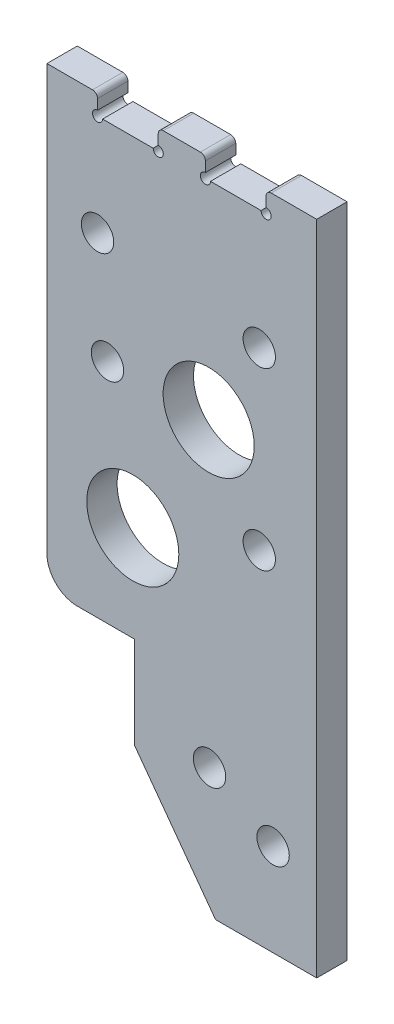
ISO-10303-21;
HEADER;
FILE_DESCRIPTION(('STEP AP214'),'2;1');
FILE_NAME('part.step','',(''),(''),'','','');
FILE_SCHEMA(('AUTOMOTIVE_DESIGN { 1 0 10303 214 1 1 1 1 }'));
ENDSEC;
DATA;
#1=APPLICATION_CONTEXT('core data for automotive mechanical design processes');
#2=APPLICATION_PROTOCOL_DEFINITION('international standard','automotive_design',2000,#1);
#3=PRODUCT_CONTEXT('',#1,'mechanical');
#4=PRODUCT('Part','Part','',(#3));
#5=PRODUCT_RELATED_PRODUCT_CATEGORY('part','',(#4));
#6=PRODUCT_DEFINITION_FORMATION('','',#4);
#7=PRODUCT_DEFINITION_CONTEXT('part definition',#1,'design');
#8=PRODUCT_DEFINITION('design','',#6,#7);
#9=PRODUCT_DEFINITION_SHAPE('','',#8);
#10=(LENGTH_UNIT() NAMED_UNIT(*) SI_UNIT(.MILLI.,.METRE.));
#11=(NAMED_UNIT(*) PLANE_ANGLE_UNIT() SI_UNIT($,.RADIAN.));
#12=(NAMED_UNIT(*) SI_UNIT($,.STERADIAN.) SOLID_ANGLE_UNIT());
#13=UNCERTAINTY_MEASURE_WITH_UNIT(LENGTH_MEASURE(1.E-05),#10,'distance_accuracy_value','');
#14=(GEOMETRIC_REPRESENTATION_CONTEXT(3) GLOBAL_UNCERTAINTY_ASSIGNED_CONTEXT((#13)) GLOBAL_UNIT_ASSIGNED_CONTEXT((#10,
#11,#12)) REPRESENTATION_CONTEXT('',''));
#15=CARTESIAN_POINT('',(0.,0.,0.));
#16=DIRECTION('',(0.,0.,1.));
#17=DIRECTION('',(1.,0.,0.));
#18=AXIS2_PLACEMENT_3D('',#15,#16,#17);
#19=CARTESIAN_POINT('',(0.,58.0360342106986,0.));
#20=DIRECTION('',(0.,-1.,0.));
#21=DIRECTION('',(0.,0.,-1.));
#22=AXIS2_PLACEMENT_3D('',#19,#20,#21);
#23=PLANE('',#22);
#24=DIRECTION('',(1.,0.,0.));
#25=VECTOR('',#24,1.);
#26=CARTESIAN_POINT('',(0.,58.0360342106986,3.));
#27=LINE('',#26,#25);
#28=CARTESIAN_POINT('',(-5.0000000000002,58.0360342106986,3.));
#29=VERTEX_POINT('',#28);
#30=CARTESIAN_POINT('',(-0.500000000000204,58.0360342106986,3.));
#31=VERTEX_POINT('',#30);
#32=EDGE_CURVE('E262',#29,#31,#27,.T.);
#33=ORIENTED_EDGE('',*,*,#32,.T.);
#34=DIRECTION('',(0.,0.,1.));
#35=VECTOR('',#34,1.);
#36=CARTESIAN_POINT('',(-0.500000000000204,58.0360342106986,0.));
#37=LINE('',#36,#35);
#38=CARTESIAN_POINT('',(-0.500000000000204,58.0360342106986,0.));
#39=VERTEX_POINT('',#38);
#40=EDGE_CURVE('E11',#31,#39,#37,.F.);
#41=ORIENTED_EDGE('',*,*,#40,.T.);
#42=DIRECTION('',(1.,0.,0.));
#43=VECTOR('',#42,1.);
#44=CARTESIAN_POINT('',(0.,58.0360342106986,0.));
#45=LINE('',#44,#43);
#46=CARTESIAN_POINT('',(-5.0000000000002,58.0360342106986,0.));
#47=VERTEX_POINT('',#46);
#48=EDGE_CURVE('E257',#47,#39,#45,.T.);
#49=ORIENTED_EDGE('',*,*,#48,.F.);
#50=DIRECTION('',(0.,0.,1.));
#51=VECTOR('',#50,1.);
#52=CARTESIAN_POINT('',(-5.0000000000002,58.0360342106986,0.));
#53=LINE('',#52,#51);
#54=EDGE_CURVE('E266',#47,#29,#53,.T.);
#55=ORIENTED_EDGE('',*,*,#54,.T.);
#56=EDGE_LOOP('',(#33,#41,#49,#55));
#57=FACE_BOUND('',#56,.T.);
#58=ADVANCED_FACE('F40',(#57),#23,.F.);
#59=CARTESIAN_POINT('',(6.4999999999998,58.0360342106986,3.));
#60=VERTEX_POINT('',#59);
#61=CARTESIAN_POINT('',(10.1622818720618,58.0360342106986,3.));
#62=VERTEX_POINT('',#61);
#63=EDGE_CURVE('E264',#60,#62,#27,.T.);
#64=ORIENTED_EDGE('',*,*,#63,.T.);
#65=DIRECTION('',(0.,0.,1.));
#66=VECTOR('',#65,1.);
#67=CARTESIAN_POINT('',(10.1622818720618,58.0360342106986,0.));
#68=LINE('',#67,#66);
#69=CARTESIAN_POINT('',(10.1622818720618,58.0360342106986,0.));
#70=VERTEX_POINT('',#69);
#71=EDGE_CURVE('E404',#62,#70,#68,.F.);
#72=ORIENTED_EDGE('',*,*,#71,.T.);
#73=CARTESIAN_POINT('',(6.4999999999998,58.0360342106986,0.));
#74=VERTEX_POINT('',#73);
#75=EDGE_CURVE('E260',#74,#70,#45,.T.);
#76=ORIENTED_EDGE('',*,*,#75,.F.);
#77=DIRECTION('',(0.,0.,1.));
#78=VECTOR('',#77,1.);
#79=CARTESIAN_POINT('',(6.4999999999998,58.0360342106986,0.));
#80=LINE('',#79,#78);
#81=EDGE_CURVE('E401',#74,#60,#80,.T.);
#82=ORIENTED_EDGE('',*,*,#81,.T.);
#83=EDGE_LOOP('',(#64,#72,#76,#82));
#84=FACE_BOUND('',#83,.T.);
#85=ADVANCED_FACE('F458',(#84),#23,.F.);
#86=CARTESIAN_POINT('',(21.6622818720618,0.,3.));
#87=DIRECTION('',(-1.,0.,0.));
#88=DIRECTION('',(0.,0.,1.));
#89=AXIS2_PLACEMENT_3D('',#86,#87,#88);
#90=PLANE('',#89);
#91=DIRECTION('',(0.,1.,0.));
#92=VECTOR('',#91,1.);
#93=CARTESIAN_POINT('',(21.6622818720618,0.,0.));
#94=LINE('',#93,#92);
#95=CARTESIAN_POINT('',(21.6622818720618,-6.90499539699892,0.));
#96=VERTEX_POINT('',#95);
#97=CARTESIAN_POINT('',(21.6622818720618,58.0360342106986,0.));
#98=VERTEX_POINT('',#97);
#99=EDGE_CURVE('E326',#96,#98,#94,.T.);
#100=ORIENTED_EDGE('',*,*,#99,.T.);
#101=DIRECTION('',(0.,0.,1.));
#102=VECTOR('',#101,1.);
#103=CARTESIAN_POINT('',(21.6622818720618,58.0360342106986,0.));
#104=LINE('',#103,#102);
#105=CARTESIAN_POINT('',(21.6622818720618,58.0360342106986,3.));
#106=VERTEX_POINT('',#105);
#107=EDGE_CURVE('E259',#98,#106,#104,.T.);
#108=ORIENTED_EDGE('',*,*,#107,.T.);
#109=DIRECTION('',(0.,1.,0.));
#110=VECTOR('',#109,1.);
#111=CARTESIAN_POINT('',(21.6622818720618,0.,3.));
#112=LINE('',#111,#110);
#113=CARTESIAN_POINT('',(21.6622818720618,-6.90499539699892,3.));
#114=VERTEX_POINT('',#113);
#115=EDGE_CURVE('E311',#114,#106,#112,.T.);
#116=ORIENTED_EDGE('',*,*,#115,.F.);
#117=DIRECTION('',(0.,0.,-1.));
#118=VECTOR('',#117,1.);
#119=CARTESIAN_POINT('',(21.6622818720618,-6.90499539699892,3.));
#120=LINE('',#119,#118);
#121=EDGE_CURVE('E320',#114,#96,#120,.T.);
#122=ORIENTED_EDGE('',*,*,#121,.T.);
#123=EDGE_LOOP('',(#100,#108,#116,#122));
#124=FACE_BOUND('',#123,.T.);
#125=ADVANCED_FACE('F465',(#124),#90,.F.);
#126=CARTESIAN_POINT('',(3.66228187206179,0.,3.));
#127=DIRECTION('',(1.,0.,0.));
#128=DIRECTION('',(0.,0.,-1.));
#129=AXIS2_PLACEMENT_3D('',#126,#127,#128);
#130=PLANE('',#129);
#131=DIRECTION('',(0.,-1.,0.));
#132=VECTOR('',#131,1.);
#133=CARTESIAN_POINT('',(3.66228187206179,0.,0.));
#134=LINE('',#133,#132);
#135=CARTESIAN_POINT('',(3.66228187206179,13.0950046030011,0.));
#136=VERTEX_POINT('',#135);
#137=CARTESIAN_POINT('',(3.66228187206179,3.99641148390984,0.));
#138=VERTEX_POINT('',#137);
#139=EDGE_CURVE('E329',#136,#138,#134,.T.);
#140=ORIENTED_EDGE('',*,*,#139,.T.);
#141=DIRECTION('',(0.,0.,-1.));
#142=VECTOR('',#141,1.);
#143=CARTESIAN_POINT('',(3.66228187206179,3.99641148390984,3.));
#144=LINE('',#143,#142);
#145=CARTESIAN_POINT('',(3.66228187206179,3.99641148390984,3.));
#146=VERTEX_POINT('',#145);
#147=EDGE_CURVE('E339',#146,#138,#144,.T.);
#148=ORIENTED_EDGE('',*,*,#147,.F.);
#149=DIRECTION('',(0.,-1.,0.));
#150=VECTOR('',#149,1.);
#151=CARTESIAN_POINT('',(3.66228187206179,0.,3.));
#152=LINE('',#151,#150);
#153=CARTESIAN_POINT('',(3.66228187206179,13.0950046030011,3.));
#154=VERTEX_POINT('',#153);
#155=EDGE_CURVE('E314',#154,#146,#152,.T.);
#156=ORIENTED_EDGE('',*,*,#155,.F.);
#157=DIRECTION('',(0.,0.,-1.));
#158=VECTOR('',#157,1.);
#159=CARTESIAN_POINT('',(3.66228187206179,13.0950046030011,3.));
#160=LINE('',#159,#158);
#161=EDGE_CURVE('E342',#154,#136,#160,.T.);
#162=ORIENTED_EDGE('',*,*,#161,.T.);
#163=EDGE_LOOP('',(#140,#148,#156,#162));
#164=FACE_BOUND('',#163,.T.);
#165=ADVANCED_FACE('F527',(#164),#130,.F.);
#166=CARTESIAN_POINT('',(4.28657415969723,3.14570345389393,3.));
#167=DIRECTION('',(0.806206221061157,0.591634624681727,0.));
#168=DIRECTION('',(-0.591634624681728,0.806206221061157,0.));
#169=AXIS2_PLACEMENT_3D('',#166,#167,#168);
#170=PLANE('',#169);
#171=DIRECTION('',(0.591634624681727,-0.806206221061157,0.));
#172=VECTOR('',#171,1.);
#173=CARTESIAN_POINT('',(4.28657415969723,3.14570345389393,0.));
#174=LINE('',#173,#172);
#175=CARTESIAN_POINT('',(11.6622818720618,-6.90499539699892,0.));
#176=VERTEX_POINT('',#175);
#177=EDGE_CURVE('E331',#138,#176,#174,.T.);
#178=ORIENTED_EDGE('',*,*,#177,.T.);
#179=DIRECTION('',(0.,0.,-1.));
#180=VECTOR('',#179,1.);
#181=CARTESIAN_POINT('',(11.6622818720618,-6.90499539699892,3.));
#182=LINE('',#181,#180);
#183=CARTESIAN_POINT('',(11.6622818720618,-6.90499539699892,3.));
#184=VERTEX_POINT('',#183);
#185=EDGE_CURVE('E336',#184,#176,#182,.T.);
#186=ORIENTED_EDGE('',*,*,#185,.F.);
#187=DIRECTION('',(0.591634624681727,-0.806206221061157,0.));
#188=VECTOR('',#187,1.);
#189=CARTESIAN_POINT('',(4.28657415969723,3.14570345389393,3.));
#190=LINE('',#189,#188);
#191=EDGE_CURVE('E316',#146,#184,#190,.T.);
#192=ORIENTED_EDGE('',*,*,#191,.F.);
#193=ORIENTED_EDGE('',*,*,#147,.T.);
#194=EDGE_LOOP('',(#178,#186,#192,#193));
#195=FACE_BOUND('',#194,.T.);
#196=ADVANCED_FACE('F523',(#195),#170,.F.);
#197=CARTESIAN_POINT('',(11.0719234852407,5.8086443959848,3.));
#198=DIRECTION('',(0.,0.,-1.));
#199=DIRECTION('',(-1.,0.,0.));
#200=AXIS2_PLACEMENT_3D('',#197,#198,#199);
#201=CYLINDRICAL_SURFACE('',#200,1.6);
#202=CARTESIAN_POINT('',(11.0719234852407,5.8086443959848,3.));
#203=DIRECTION('',(0.,0.,1.));
#204=DIRECTION('',(1.,0.,0.));
#205=AXIS2_PLACEMENT_3D('',#202,#203,#204);
#206=CIRCLE('',#205,1.6);
#207=CARTESIAN_POINT('',(12.6719234852407,5.8086443959848,3.));
#208=VERTEX_POINT('',#207);
#209=EDGE_CURVE('E307',#208,#208,#206,.T.);
#210=ORIENTED_EDGE('',*,*,#209,.T.);
#211=EDGE_LOOP('',(#210));
#212=FACE_BOUND('',#211,.T.);
#213=CARTESIAN_POINT('',(11.0719234852407,5.8086443959848,0.));
#214=DIRECTION('',(0.,0.,1.));
#215=DIRECTION('',(1.,0.,0.));
#216=AXIS2_PLACEMENT_3D('',#213,#214,#215);
#217=CIRCLE('',#216,1.6);
#218=CARTESIAN_POINT('',(12.6719234852407,5.8086443959848,0.));
#219=VERTEX_POINT('',#218);
#220=EDGE_CURVE('E323',#219,#219,#217,.T.);
#221=ORIENTED_EDGE('',*,*,#220,.F.);
#222=EDGE_LOOP('',(#221));
#223=FACE_BOUND('',#222,.T.);
#224=ADVANCED_FACE('F559',(#212,#223),#201,.F.);
#225=CARTESIAN_POINT('',(17.3507061173,2.224156972777,3.));
#226=DIRECTION('',(0.,0.,-1.));
#227=DIRECTION('',(-1.,0.,0.));
#228=AXIS2_PLACEMENT_3D('',#225,#226,#227);
#229=CYLINDRICAL_SURFACE('',#228,1.6);
#230=CARTESIAN_POINT('',(17.3507061173,2.224156972777,3.));
#231=DIRECTION('',(0.,0.,1.));
#232=DIRECTION('',(1.,0.,0.));
#233=AXIS2_PLACEMENT_3D('',#230,#231,#232);
#234=CIRCLE('',#233,1.6);
#235=CARTESIAN_POINT('',(18.9507061173,2.224156972777,3.));
#236=VERTEX_POINT('',#235);
#237=EDGE_CURVE('E304',#236,#236,#234,.T.);
#238=ORIENTED_EDGE('',*,*,#237,.T.);
#239=EDGE_LOOP('',(#238));
#240=FACE_BOUND('',#239,.T.);
#241=CARTESIAN_POINT('',(17.3507061173,2.224156972777,0.));
#242=DIRECTION('',(0.,0.,1.));
#243=DIRECTION('',(1.,0.,0.));
#244=AXIS2_PLACEMENT_3D('',#241,#242,#243);
#245=CIRCLE('',#244,1.6);
#246=CARTESIAN_POINT('',(18.9507061173,2.224156972777,0.));
#247=VERTEX_POINT('',#246);
#248=EDGE_CURVE('E300',#247,#247,#245,.T.);
#249=ORIENTED_EDGE('',*,*,#248,.F.);
#250=EDGE_LOOP('',(#249));
#251=FACE_BOUND('',#250,.T.);
#252=ADVANCED_FACE('F556',(#240,#251),#229,.F.);
#253=CARTESIAN_POINT('',(0.,-6.90499539699891,3.));
#254=DIRECTION('',(0.,1.,0.));
#255=DIRECTION('',(-1.,0.,0.));
#256=AXIS2_PLACEMENT_3D('',#253,#254,#255);
#257=PLANE('',#256);
#258=DIRECTION('',(1.,0.,0.));
#259=VECTOR('',#258,1.);
#260=CARTESIAN_POINT('',(0.,-6.90499539699891,0.));
#261=LINE('',#260,#259);
#262=EDGE_CURVE('E308',#176,#96,#261,.T.);
#263=ORIENTED_EDGE('',*,*,#262,.T.);
#264=ORIENTED_EDGE('',*,*,#121,.F.);
#265=DIRECTION('',(1.,0.,0.));
#266=VECTOR('',#265,1.);
#267=CARTESIAN_POINT('',(0.,-6.90499539699891,3.));
#268=LINE('',#267,#266);
#269=EDGE_CURVE('E318',#184,#114,#268,.T.);
#270=ORIENTED_EDGE('',*,*,#269,.F.);
#271=ORIENTED_EDGE('',*,*,#185,.T.);
#272=EDGE_LOOP('',(#263,#264,#270,#271));
#273=FACE_BOUND('',#272,.T.);
#274=ADVANCED_FACE('F519',(#273),#257,.F.);
#275=CARTESIAN_POINT('',(0.,0.,3.));
#276=DIRECTION('',(0.,0.,1.));
#277=DIRECTION('',(1.,0.,0.));
#278=AXIS2_PLACEMENT_3D('',#275,#276,#277);
#279=PLANE('',#278);
#280=CARTESIAN_POINT('',(17.1622818720618,58.0360342106986,3.));
#281=VERTEX_POINT('',#280);
#282=EDGE_CURVE('E265',#281,#106,#27,.T.);
#283=ORIENTED_EDGE('',*,*,#282,.F.);
#284=CARTESIAN_POINT('',(17.1622818720618,57.5360342106986,3.));
#285=DIRECTION('',(0.,0.,1.));
#286=DIRECTION('',(1.,0.,0.));
#287=AXIS2_PLACEMENT_3D('',#284,#285,#286);
#288=CIRCLE('',#287,0.5);
#289=CARTESIAN_POINT('',(16.6622818720618,57.5360342106986,3.));
#290=VERTEX_POINT('',#289);
#291=EDGE_CURVE('E387',#281,#290,#288,.T.);
#292=ORIENTED_EDGE('',*,*,#291,.T.);
#293=DIRECTION('',(0.,1.,0.));
#294=VECTOR('',#293,1.);
#295=CARTESIAN_POINT('',(16.6622818720618,58.0360342106986,3.));
#296=LINE('',#295,#294);
#297=CARTESIAN_POINT('',(16.6622818720618,56.5360342106986,3.));
#298=VERTEX_POINT('',#297);
#299=EDGE_CURVE('E243',#298,#290,#296,.T.);
#300=ORIENTED_EDGE('',*,*,#299,.F.);
#301=CARTESIAN_POINT('',(16.6622818720618,56.0360342106986,3.));
#302=DIRECTION('',(0.,0.,1.));
#303=DIRECTION('',(1.,0.,0.));
#304=AXIS2_PLACEMENT_3D('',#301,#302,#303);
#305=CIRCLE('',#304,0.499999999999999);
#306=CARTESIAN_POINT('',(16.1622818720618,56.0360342106986,3.));
#307=VERTEX_POINT('',#306);
#308=EDGE_CURVE('E439',#307,#298,#305,.T.);
#309=ORIENTED_EDGE('',*,*,#308,.F.);
#310=DIRECTION('',(1.,0.,0.));
#311=VECTOR('',#310,1.);
#312=CARTESIAN_POINT('',(10.6622818720618,56.0360342106986,3.));
#313=LINE('',#312,#311);
#314=CARTESIAN_POINT('',(11.1622818720618,56.0360342106986,3.));
#315=VERTEX_POINT('',#314);
#316=EDGE_CURVE('E251',#315,#307,#313,.T.);
#317=ORIENTED_EDGE('',*,*,#316,.F.);
#318=CARTESIAN_POINT('',(10.6622818720618,56.0360342106986,3.));
#319=DIRECTION('',(0.,0.,1.));
#320=DIRECTION('',(1.,0.,0.));
#321=AXIS2_PLACEMENT_3D('',#318,#319,#320);
#322=CIRCLE('',#321,0.500000000000001);
#323=CARTESIAN_POINT('',(10.6622818720618,56.5360342106986,3.));
#324=VERTEX_POINT('',#323);
#325=EDGE_CURVE('E213',#324,#315,#322,.T.);
#326=ORIENTED_EDGE('',*,*,#325,.F.);
#327=DIRECTION('',(0.,-1.,0.));
#328=VECTOR('',#327,1.);
#329=CARTESIAN_POINT('',(10.6622818720618,58.0360342106986,3.));
#330=LINE('',#329,#328);
#331=CARTESIAN_POINT('',(10.6622818720618,57.5360342106986,3.));
#332=VERTEX_POINT('',#331);
#333=EDGE_CURVE('E249',#332,#324,#330,.T.);
#334=ORIENTED_EDGE('',*,*,#333,.F.);
#335=CARTESIAN_POINT('',(10.1622818720618,57.5360342106986,3.));
#336=DIRECTION('',(0.,0.,1.));
#337=DIRECTION('',(1.,0.,0.));
#338=AXIS2_PLACEMENT_3D('',#335,#336,#337);
#339=CIRCLE('',#338,0.5);
#340=EDGE_CURVE('E385',#332,#62,#339,.T.);
#341=ORIENTED_EDGE('',*,*,#340,.T.);
#342=ORIENTED_EDGE('',*,*,#63,.F.);
#343=CARTESIAN_POINT('',(6.4999999999998,57.5360342106986,3.));
#344=DIRECTION('',(0.,0.,1.));
#345=DIRECTION('',(1.,0.,0.));
#346=AXIS2_PLACEMENT_3D('',#343,#344,#345);
#347=CIRCLE('',#346,0.5);
#348=CARTESIAN_POINT('',(5.9999999999998,57.5360342106986,3.));
#349=VERTEX_POINT('',#348);
#350=EDGE_CURVE('E230',#60,#349,#347,.T.);
#351=ORIENTED_EDGE('',*,*,#350,.T.);
#352=DIRECTION('',(0.,1.,0.));
#353=VECTOR('',#352,1.);
#354=CARTESIAN_POINT('',(5.9999999999998,58.0360342106986,3.));
#355=LINE('',#354,#353);
#356=CARTESIAN_POINT('',(5.9999999999998,56.5360342106986,3.));
#357=VERTEX_POINT('',#356);
#358=EDGE_CURVE('E219',#357,#349,#355,.T.);
#359=ORIENTED_EDGE('',*,*,#358,.F.);
#360=CARTESIAN_POINT('',(5.9999999999998,56.0360342106986,3.));
#361=DIRECTION('',(0.,0.,1.));
#362=DIRECTION('',(1.,0.,0.));
#363=AXIS2_PLACEMENT_3D('',#360,#361,#362);
#364=CIRCLE('',#363,0.500000000000002);
#365=CARTESIAN_POINT('',(5.49999999999979,56.0360342106986,3.));
#366=VERTEX_POINT('',#365);
#367=EDGE_CURVE('E201',#366,#357,#364,.T.);
#368=ORIENTED_EDGE('',*,*,#367,.F.);
#369=DIRECTION('',(1.,0.,0.));
#370=VECTOR('',#369,1.);
#371=CARTESIAN_POINT('',(-2.03585079067445E-13,56.0360342106986,3.));
#372=LINE('',#371,#370);
#373=CARTESIAN_POINT('',(0.499999999999797,56.0360342106986,3.));
#374=VERTEX_POINT('',#373);
#375=EDGE_CURVE('E232',#374,#366,#372,.T.);
#376=ORIENTED_EDGE('',*,*,#375,.F.);
#377=CARTESIAN_POINT('',(-2.03585079067445E-13,56.0360342106986,3.));
#378=DIRECTION('',(0.,0.,1.));
#379=DIRECTION('',(1.,0.,0.));
#380=AXIS2_PLACEMENT_3D('',#377,#378,#379);
#381=CIRCLE('',#380,0.5);
#382=CARTESIAN_POINT('',(-2.03646311407403E-13,56.5360342106986,3.));
#383=VERTEX_POINT('',#382);
#384=EDGE_CURVE('E212',#383,#374,#381,.T.);
#385=ORIENTED_EDGE('',*,*,#384,.F.);
#386=DIRECTION('',(0.,-1.,0.));
#387=VECTOR('',#386,1.);
#388=CARTESIAN_POINT('',(-2.03830008427275E-13,58.0360342106986,3.));
#389=LINE('',#388,#387);
#390=CARTESIAN_POINT('',(-2.03768776087317E-13,57.5360342106986,3.));
#391=VERTEX_POINT('',#390);
#392=EDGE_CURVE('E236',#391,#383,#389,.T.);
#393=ORIENTED_EDGE('',*,*,#392,.F.);
#394=CARTESIAN_POINT('',(-0.500000000000204,57.5360342106986,3.));
#395=DIRECTION('',(0.,0.,1.));
#396=DIRECTION('',(1.,0.,0.));
#397=AXIS2_PLACEMENT_3D('',#394,#395,#396);
#398=CIRCLE('',#397,0.5);
#399=EDGE_CURVE('E382',#391,#31,#398,.T.);
#400=ORIENTED_EDGE('',*,*,#399,.T.);
#401=ORIENTED_EDGE('',*,*,#32,.F.);
#402=DIRECTION('',(0.,-1.,0.));
#403=VECTOR('',#402,1.);
#404=CARTESIAN_POINT('',(-5.00000000000018,55.0950046030011,3.));
#405=LINE('',#404,#403);
#406=CARTESIAN_POINT('',(-5.00000000000018,16.0950046030011,3.));
#407=VERTEX_POINT('',#406);
#408=EDGE_CURVE('E298',#29,#407,#405,.T.);
#409=ORIENTED_EDGE('',*,*,#408,.T.);
#410=CARTESIAN_POINT('',(-2.00000000000018,16.0950046030011,3.));
#411=DIRECTION('',(0.,0.,1.));
#412=DIRECTION('',(1.,0.,0.));
#413=AXIS2_PLACEMENT_3D('',#410,#411,#412);
#414=CIRCLE('',#413,3.);
#415=CARTESIAN_POINT('',(-2.00000000000018,13.0950046030011,3.));
#416=VERTEX_POINT('',#415);
#417=EDGE_CURVE('E348',#407,#416,#414,.T.);
#418=ORIENTED_EDGE('',*,*,#417,.T.);
#419=DIRECTION('',(1.,0.,0.));
#420=VECTOR('',#419,1.);
#421=CARTESIAN_POINT('',(-5.00000000000018,13.0950046030011,3.));
#422=LINE('',#421,#420);
#423=EDGE_CURVE('E301',#416,#154,#422,.T.);
#424=ORIENTED_EDGE('',*,*,#423,.T.);
#425=ORIENTED_EDGE('',*,*,#155,.T.);
#426=ORIENTED_EDGE('',*,*,#191,.T.);
#427=ORIENTED_EDGE('',*,*,#269,.T.);
#428=ORIENTED_EDGE('',*,*,#115,.T.);
#429=EDGE_LOOP('',(#283,#292,#300,#309,#317,#326,#334,#341,#342,#351,#359,#368,#376,#385,#393,
#400,#401,#409,#418,#424,#425,#426,#427,#428));
#430=FACE_BOUND('',#429,.T.);
#431=CARTESIAN_POINT('',(-2.03830008427275E-13,46.0360342106986,3.));
#432=DIRECTION('',(0.,0.,1.));
#433=DIRECTION('',(1.,0.,0.));
#434=AXIS2_PLACEMENT_3D('',#431,#432,#433);
#435=CIRCLE('',#434,1.6);
#436=CARTESIAN_POINT('',(1.5999999999998,46.0360342106986,3.));
#437=VERTEX_POINT('',#436);
#438=EDGE_CURVE('E269',#437,#437,#435,.F.);
#439=ORIENTED_EDGE('',*,*,#438,.T.);
#440=EDGE_LOOP('',(#439));
#441=FACE_BOUND('',#440,.T.);
#442=CARTESIAN_POINT('',(0.984643758680834,35.5323305802641,3.));
#443=DIRECTION('',(0.,0.,1.));
#444=DIRECTION('',(1.,0.,0.));
#445=AXIS2_PLACEMENT_3D('',#442,#443,#444);
#446=CIRCLE('',#445,1.6);
#447=CARTESIAN_POINT('',(2.58464375868083,35.5323305802641,3.));
#448=VERTEX_POINT('',#447);
#449=EDGE_CURVE('E275',#448,#448,#446,.T.);
#450=ORIENTED_EDGE('',*,*,#449,.F.);
#451=EDGE_LOOP('',(#450));
#452=FACE_BOUND('',#451,.T.);
#453=CARTESIAN_POINT('',(15.9846437586809,44.1925846181082,3.));
#454=DIRECTION('',(0.,0.,1.));
#455=DIRECTION('',(1.,0.,0.));
#456=AXIS2_PLACEMENT_3D('',#453,#454,#455);
#457=CIRCLE('',#456,1.6);
#458=CARTESIAN_POINT('',(17.5846437586809,44.1925846181082,3.));
#459=VERTEX_POINT('',#458);
#460=EDGE_CURVE('E279',#459,#459,#457,.T.);
#461=ORIENTED_EDGE('',*,*,#460,.F.);
#462=EDGE_LOOP('',(#461));
#463=FACE_BOUND('',#462,.T.);
#464=CARTESIAN_POINT('',(15.9846437586806,26.8720765424193,3.));
#465=DIRECTION('',(0.,0.,1.));
#466=DIRECTION('',(1.,0.,0.));
#467=AXIS2_PLACEMENT_3D('',#464,#465,#466);
#468=CIRCLE('',#467,1.6);
#469=CARTESIAN_POINT('',(17.5846437586806,26.8720765424193,3.));
#470=VERTEX_POINT('',#469);
#471=EDGE_CURVE('E282',#470,#470,#468,.T.);
#472=ORIENTED_EDGE('',*,*,#471,.F.);
#473=EDGE_LOOP('',(#472));
#474=FACE_BOUND('',#473,.T.);
#475=CARTESIAN_POINT('',(10.9846437586808,35.5323305802638,3.));
#476=DIRECTION('',(0.,0.,1.));
#477=DIRECTION('',(1.,0.,0.));
#478=AXIS2_PLACEMENT_3D('',#475,#476,#477);
#479=CIRCLE('',#478,4.5);
#480=CARTESIAN_POINT('',(15.4846437586808,35.5323305802638,3.));
#481=VERTEX_POINT('',#480);
#482=EDGE_CURVE('E285',#481,#481,#479,.T.);
#483=ORIENTED_EDGE('',*,*,#482,.F.);
#484=EDGE_LOOP('',(#483));
#485=FACE_BOUND('',#484,.T.);
#486=CARTESIAN_POINT('',(3.48464375868086,22.5419495234972,3.));
#487=DIRECTION('',(0.,0.,1.));
#488=DIRECTION('',(1.,0.,0.));
#489=AXIS2_PLACEMENT_3D('',#486,#487,#488);
#490=CIRCLE('',#489,4.55);
#491=CARTESIAN_POINT('',(8.03464375868087,22.5419495234972,3.));
#492=VERTEX_POINT('',#491);
#493=EDGE_CURVE('E290',#492,#492,#490,.T.);
#494=ORIENTED_EDGE('',*,*,#493,.F.);
#495=EDGE_LOOP('',(#494));
#496=FACE_BOUND('',#495,.T.);
#497=ORIENTED_EDGE('',*,*,#237,.F.);
#498=EDGE_LOOP('',(#497));
#499=FACE_BOUND('',#498,.T.);
#500=ORIENTED_EDGE('',*,*,#209,.F.);
#501=EDGE_LOOP('',(#500));
#502=FACE_BOUND('',#501,.T.);
#503=ADVANCED_FACE('F227',(#430,#441,#452,#463,#474,#485,#496,#499,#502),#279,.T.);
#504=CARTESIAN_POINT('',(0.,0.,0.));
#505=DIRECTION('',(0.,0.,1.));
#506=DIRECTION('',(1.,0.,0.));
#507=AXIS2_PLACEMENT_3D('',#504,#505,#506);
#508=PLANE('',#507);
#509=DIRECTION('',(0.,1.,0.));
#510=VECTOR('',#509,1.);
#511=CARTESIAN_POINT('',(16.6622818720618,58.0360342106986,0.));
#512=LINE('',#511,#510);
#513=CARTESIAN_POINT('',(16.6622818720618,56.5360342106986,0.));
#514=VERTEX_POINT('',#513);
#515=CARTESIAN_POINT('',(16.6622818720618,57.5360342106986,0.));
#516=VERTEX_POINT('',#515);
#517=EDGE_CURVE('E246',#514,#516,#512,.T.);
#518=ORIENTED_EDGE('',*,*,#517,.T.);
#519=CARTESIAN_POINT('',(17.1622818720618,57.5360342106986,0.));
#520=DIRECTION('',(0.,0.,1.));
#521=DIRECTION('',(1.,0.,0.));
#522=AXIS2_PLACEMENT_3D('',#519,#520,#521);
#523=CIRCLE('',#522,0.5);
#524=CARTESIAN_POINT('',(17.1622818720618,58.0360342106986,0.));
#525=VERTEX_POINT('',#524);
#526=EDGE_CURVE('E396',#516,#525,#523,.F.);
#527=ORIENTED_EDGE('',*,*,#526,.T.);
#528=EDGE_CURVE('E261',#525,#98,#45,.T.);
#529=ORIENTED_EDGE('',*,*,#528,.T.);
#530=ORIENTED_EDGE('',*,*,#99,.F.);
#531=ORIENTED_EDGE('',*,*,#262,.F.);
#532=ORIENTED_EDGE('',*,*,#177,.F.);
#533=ORIENTED_EDGE('',*,*,#139,.F.);
#534=DIRECTION('',(1.,0.,0.));
#535=VECTOR('',#534,1.);
#536=CARTESIAN_POINT('',(-5.00000000000018,13.0950046030011,0.));
#537=LINE('',#536,#535);
#538=CARTESIAN_POINT('',(-2.00000000000018,13.0950046030011,0.));
#539=VERTEX_POINT('',#538);
#540=EDGE_CURVE('E295',#539,#136,#537,.T.);
#541=ORIENTED_EDGE('',*,*,#540,.F.);
#542=CARTESIAN_POINT('',(-2.00000000000018,16.0950046030011,0.));
#543=DIRECTION('',(0.,0.,1.));
#544=DIRECTION('',(1.,0.,0.));
#545=AXIS2_PLACEMENT_3D('',#542,#543,#544);
#546=CIRCLE('',#545,3.);
#547=CARTESIAN_POINT('',(-5.00000000000018,16.0950046030011,0.));
#548=VERTEX_POINT('',#547);
#549=EDGE_CURVE('E352',#539,#548,#546,.F.);
#550=ORIENTED_EDGE('',*,*,#549,.T.);
#551=DIRECTION('',(0.,-1.,0.));
#552=VECTOR('',#551,1.);
#553=CARTESIAN_POINT('',(-5.00000000000018,55.0950046030011,0.));
#554=LINE('',#553,#552);
#555=EDGE_CURVE('E297',#47,#548,#554,.T.);
#556=ORIENTED_EDGE('',*,*,#555,.F.);
#557=ORIENTED_EDGE('',*,*,#48,.T.);
#558=CARTESIAN_POINT('',(-0.500000000000204,57.5360342106986,0.));
#559=DIRECTION('',(0.,0.,1.));
#560=DIRECTION('',(1.,0.,0.));
#561=AXIS2_PLACEMENT_3D('',#558,#559,#560);
#562=CIRCLE('',#561,0.5);
#563=CARTESIAN_POINT('',(-2.03768776087317E-13,57.5360342106986,0.));
#564=VERTEX_POINT('',#563);
#565=EDGE_CURVE('E391',#39,#564,#562,.F.);
#566=ORIENTED_EDGE('',*,*,#565,.T.);
#567=DIRECTION('',(0.,-1.,0.));
#568=VECTOR('',#567,1.);
#569=CARTESIAN_POINT('',(-2.03830008427275E-13,58.0360342106986,0.));
#570=LINE('',#569,#568);
#571=CARTESIAN_POINT('',(-2.03646311407403E-13,56.5360342106986,0.));
#572=VERTEX_POINT('',#571);
#573=EDGE_CURVE('E231',#564,#572,#570,.T.);
#574=ORIENTED_EDGE('',*,*,#573,.T.);
#575=CARTESIAN_POINT('',(-2.03585079067445E-13,56.0360342106986,0.));
#576=DIRECTION('',(0.,0.,1.));
#577=DIRECTION('',(1.,0.,0.));
#578=AXIS2_PLACEMENT_3D('',#575,#576,#577);
#579=CIRCLE('',#578,0.5);
#580=CARTESIAN_POINT('',(0.499999999999797,56.0360342106986,0.));
#581=VERTEX_POINT('',#580);
#582=EDGE_CURVE('E223',#572,#581,#579,.T.);
#583=ORIENTED_EDGE('',*,*,#582,.T.);
#584=DIRECTION('',(1.,0.,0.));
#585=VECTOR('',#584,1.);
#586=CARTESIAN_POINT('',(-2.03585079067445E-13,56.0360342106986,0.));
#587=LINE('',#586,#585);
#588=CARTESIAN_POINT('',(5.49999999999979,56.0360342106986,0.));
#589=VERTEX_POINT('',#588);
#590=EDGE_CURVE('E234',#581,#589,#587,.T.);
#591=ORIENTED_EDGE('',*,*,#590,.T.);
#592=CARTESIAN_POINT('',(5.9999999999998,56.0360342106986,0.));
#593=DIRECTION('',(0.,0.,1.));
#594=DIRECTION('',(1.,0.,0.));
#595=AXIS2_PLACEMENT_3D('',#592,#593,#594);
#596=CIRCLE('',#595,0.500000000000002);
#597=CARTESIAN_POINT('',(5.9999999999998,56.5360342106986,0.));
#598=VERTEX_POINT('',#597);
#599=EDGE_CURVE('E224',#589,#598,#596,.T.);
#600=ORIENTED_EDGE('',*,*,#599,.T.);
#601=DIRECTION('',(0.,1.,0.));
#602=VECTOR('',#601,1.);
#603=CARTESIAN_POINT('',(5.9999999999998,58.0360342106986,0.));
#604=LINE('',#603,#602);
#605=CARTESIAN_POINT('',(5.9999999999998,57.5360342106986,0.));
#606=VERTEX_POINT('',#605);
#607=EDGE_CURVE('E222',#598,#606,#604,.T.);
#608=ORIENTED_EDGE('',*,*,#607,.T.);
#609=CARTESIAN_POINT('',(6.4999999999998,57.5360342106986,0.));
#610=DIRECTION('',(0.,0.,1.));
#611=DIRECTION('',(1.,0.,0.));
#612=AXIS2_PLACEMENT_3D('',#609,#610,#611);
#613=CIRCLE('',#612,0.5);
#614=EDGE_CURVE('E393',#606,#74,#613,.F.);
#615=ORIENTED_EDGE('',*,*,#614,.T.);
#616=ORIENTED_EDGE('',*,*,#75,.T.);
#617=CARTESIAN_POINT('',(10.1622818720618,57.5360342106986,0.));
#618=DIRECTION('',(0.,0.,1.));
#619=DIRECTION('',(1.,0.,0.));
#620=AXIS2_PLACEMENT_3D('',#617,#618,#619);
#621=CIRCLE('',#620,0.5);
#622=CARTESIAN_POINT('',(10.6622818720618,57.5360342106986,0.));
#623=VERTEX_POINT('',#622);
#624=EDGE_CURVE('E61',#70,#623,#621,.F.);
#625=ORIENTED_EDGE('',*,*,#624,.T.);
#626=DIRECTION('',(0.,-1.,0.));
#627=VECTOR('',#626,1.);
#628=CARTESIAN_POINT('',(10.6622818720618,58.0360342106986,0.));
#629=LINE('',#628,#627);
#630=CARTESIAN_POINT('',(10.6622818720618,56.5360342106986,0.));
#631=VERTEX_POINT('',#630);
#632=EDGE_CURVE('E240',#623,#631,#629,.T.);
#633=ORIENTED_EDGE('',*,*,#632,.T.);
#634=CARTESIAN_POINT('',(10.6622818720618,56.0360342106986,0.));
#635=DIRECTION('',(0.,0.,1.));
#636=DIRECTION('',(1.,0.,0.));
#637=AXIS2_PLACEMENT_3D('',#634,#635,#636);
#638=CIRCLE('',#637,0.500000000000001);
#639=CARTESIAN_POINT('',(11.1622818720618,56.0360342106986,0.));
#640=VERTEX_POINT('',#639);
#641=EDGE_CURVE('E425',#631,#640,#638,.T.);
#642=ORIENTED_EDGE('',*,*,#641,.T.);
#643=DIRECTION('',(1.,0.,0.));
#644=VECTOR('',#643,1.);
#645=CARTESIAN_POINT('',(10.6622818720618,56.0360342106986,0.));
#646=LINE('',#645,#644);
#647=CARTESIAN_POINT('',(16.1622818720618,56.0360342106986,0.));
#648=VERTEX_POINT('',#647);
#649=EDGE_CURVE('E242',#640,#648,#646,.T.);
#650=ORIENTED_EDGE('',*,*,#649,.T.);
#651=CARTESIAN_POINT('',(16.6622818720618,56.0360342106986,0.));
#652=DIRECTION('',(0.,0.,1.));
#653=DIRECTION('',(1.,0.,0.));
#654=AXIS2_PLACEMENT_3D('',#651,#652,#653);
#655=CIRCLE('',#654,0.499999999999999);
#656=EDGE_CURVE('E431',#648,#514,#655,.T.);
#657=ORIENTED_EDGE('',*,*,#656,.T.);
#658=EDGE_LOOP('',(#518,#527,#529,#530,#531,#532,#533,#541,#550,#556,#557,#566,#574,#583,#591,
#600,#608,#615,#616,#625,#633,#642,#650,#657));
#659=FACE_BOUND('',#658,.T.);
#660=CARTESIAN_POINT('',(-2.03830008427275E-13,46.0360342106986,0.));
#661=DIRECTION('',(0.,0.,1.));
#662=DIRECTION('',(1.,0.,0.));
#663=AXIS2_PLACEMENT_3D('',#660,#661,#662);
#664=CIRCLE('',#663,1.6);
#665=CARTESIAN_POINT('',(1.5999999999998,46.0360342106986,0.));
#666=VERTEX_POINT('',#665);
#667=EDGE_CURVE('E274',#666,#666,#664,.F.);
#668=ORIENTED_EDGE('',*,*,#667,.F.);
#669=EDGE_LOOP('',(#668));
#670=FACE_BOUND('',#669,.T.);
#671=CARTESIAN_POINT('',(0.984643758680834,35.5323305802641,0.));
#672=DIRECTION('',(0.,0.,1.));
#673=DIRECTION('',(1.,0.,0.));
#674=AXIS2_PLACEMENT_3D('',#671,#672,#673);
#675=CIRCLE('',#674,1.6);
#676=CARTESIAN_POINT('',(2.58464375868083,35.5323305802641,0.));
#677=VERTEX_POINT('',#676);
#678=EDGE_CURVE('E289',#677,#677,#675,.T.);
#679=ORIENTED_EDGE('',*,*,#678,.T.);
#680=EDGE_LOOP('',(#679));
#681=FACE_BOUND('',#680,.T.);
#682=CARTESIAN_POINT('',(15.9846437586809,44.1925846181082,0.));
#683=DIRECTION('',(0.,0.,1.));
#684=DIRECTION('',(1.,0.,0.));
#685=AXIS2_PLACEMENT_3D('',#682,#683,#684);
#686=CIRCLE('',#685,1.6);
#687=CARTESIAN_POINT('',(17.5846437586809,44.1925846181082,0.));
#688=VERTEX_POINT('',#687);
#689=EDGE_CURVE('E362',#688,#688,#686,.T.);
#690=ORIENTED_EDGE('',*,*,#689,.T.);
#691=EDGE_LOOP('',(#690));
#692=FACE_BOUND('',#691,.T.);
#693=CARTESIAN_POINT('',(15.9846437586806,26.8720765424193,0.));
#694=DIRECTION('',(0.,0.,1.));
#695=DIRECTION('',(1.,0.,0.));
#696=AXIS2_PLACEMENT_3D('',#693,#694,#695);
#697=CIRCLE('',#696,1.6);
#698=CARTESIAN_POINT('',(17.5846437586806,26.8720765424193,0.));
#699=VERTEX_POINT('',#698);
#700=EDGE_CURVE('E278',#699,#699,#697,.T.);
#701=ORIENTED_EDGE('',*,*,#700,.T.);
#702=EDGE_LOOP('',(#701));
#703=FACE_BOUND('',#702,.T.);
#704=CARTESIAN_POINT('',(10.9846437586808,35.5323305802638,0.));
#705=DIRECTION('',(0.,0.,1.));
#706=DIRECTION('',(1.,0.,0.));
#707=AXIS2_PLACEMENT_3D('',#704,#705,#706);
#708=CIRCLE('',#707,4.5);
#709=CARTESIAN_POINT('',(15.4846437586808,35.5323305802638,0.));
#710=VERTEX_POINT('',#709);
#711=EDGE_CURVE('E288',#710,#710,#708,.T.);
#712=ORIENTED_EDGE('',*,*,#711,.T.);
#713=EDGE_LOOP('',(#712));
#714=FACE_BOUND('',#713,.T.);
#715=CARTESIAN_POINT('',(3.48464375868086,22.5419495234972,0.));
#716=DIRECTION('',(0.,0.,1.));
#717=DIRECTION('',(1.,0.,0.));
#718=AXIS2_PLACEMENT_3D('',#715,#716,#717);
#719=CIRCLE('',#718,4.55);
#720=CARTESIAN_POINT('',(8.03464375868087,22.5419495234972,0.));
#721=VERTEX_POINT('',#720);
#722=EDGE_CURVE('E294',#721,#721,#719,.T.);
#723=ORIENTED_EDGE('',*,*,#722,.T.);
#724=EDGE_LOOP('',(#723));
#725=FACE_BOUND('',#724,.T.);
#726=ORIENTED_EDGE('',*,*,#248,.T.);
#727=EDGE_LOOP('',(#726));
#728=FACE_BOUND('',#727,.T.);
#729=ORIENTED_EDGE('',*,*,#220,.T.);
#730=EDGE_LOOP('',(#729));
#731=FACE_BOUND('',#730,.T.);
#732=ADVANCED_FACE('F448',(#659,#670,#681,#692,#703,#714,#725,#728,#731),#508,.F.);
#733=CARTESIAN_POINT('',(-5.00000000000018,13.0950046030011,0.));
#734=DIRECTION('',(0.,-1.,0.));
#735=DIRECTION('',(0.,0.,-1.));
#736=AXIS2_PLACEMENT_3D('',#733,#734,#735);
#737=PLANE('',#736);
#738=ORIENTED_EDGE('',*,*,#423,.F.);
#739=DIRECTION('',(0.,0.,1.));
#740=VECTOR('',#739,1.);
#741=CARTESIAN_POINT('',(-2.00000000000018,13.0950046030011,0.));
#742=LINE('',#741,#740);
#743=EDGE_CURVE('E350',#416,#539,#742,.F.);
#744=ORIENTED_EDGE('',*,*,#743,.T.);
#745=ORIENTED_EDGE('',*,*,#540,.T.);
#746=ORIENTED_EDGE('',*,*,#161,.F.);
#747=EDGE_LOOP('',(#738,#744,#745,#746));
#748=FACE_BOUND('',#747,.T.);
#749=ADVANCED_FACE('F541',(#748),#737,.T.);
#750=CARTESIAN_POINT('',(-5.00000000000018,55.0950046030011,0.));
#751=DIRECTION('',(-1.,0.,0.));
#752=DIRECTION('',(0.,-1.,0.));
#753=AXIS2_PLACEMENT_3D('',#750,#751,#752);
#754=PLANE('',#753);
#755=ORIENTED_EDGE('',*,*,#408,.F.);
#756=ORIENTED_EDGE('',*,*,#54,.F.);
#757=ORIENTED_EDGE('',*,*,#555,.T.);
#758=DIRECTION('',(0.,0.,1.));
#759=VECTOR('',#758,1.);
#760=CARTESIAN_POINT('',(-5.00000000000018,16.0950046030011,0.));
#761=LINE('',#760,#759);
#762=EDGE_CURVE('E345',#548,#407,#761,.T.);
#763=ORIENTED_EDGE('',*,*,#762,.T.);
#764=EDGE_LOOP('',(#755,#756,#757,#763));
#765=FACE_BOUND('',#764,.T.);
#766=ADVANCED_FACE('F538',(#765),#754,.T.);
#767=CARTESIAN_POINT('',(-2.00000000000018,16.0950046030011,0.));
#768=DIRECTION('',(0.,0.,1.));
#769=DIRECTION('',(1.,0.,0.));
#770=AXIS2_PLACEMENT_3D('',#767,#768,#769);
#771=CYLINDRICAL_SURFACE('',#770,3.);
#772=ORIENTED_EDGE('',*,*,#549,.F.);
#773=ORIENTED_EDGE('',*,*,#743,.F.);
#774=ORIENTED_EDGE('',*,*,#417,.F.);
#775=ORIENTED_EDGE('',*,*,#762,.F.);
#776=EDGE_LOOP('',(#772,#773,#774,#775));
#777=FACE_BOUND('',#776,.T.);
#778=ADVANCED_FACE('F535',(#777),#771,.T.);
#779=CARTESIAN_POINT('',(3.48464375868086,22.5419495234972,-7.));
#780=DIRECTION('',(0.,0.,1.));
#781=DIRECTION('',(1.,0.,0.));
#782=AXIS2_PLACEMENT_3D('',#779,#780,#781);
#783=CYLINDRICAL_SURFACE('',#782,4.55);
#784=ORIENTED_EDGE('',*,*,#493,.T.);
#785=EDGE_LOOP('',(#784));
#786=FACE_BOUND('',#785,.T.);
#787=ORIENTED_EDGE('',*,*,#722,.F.);
#788=EDGE_LOOP('',(#787));
#789=FACE_BOUND('',#788,.T.);
#790=ADVANCED_FACE('F571',(#786,#789),#783,.F.);
#791=CARTESIAN_POINT('',(10.9846437586808,35.5323305802638,-23.41));
#792=DIRECTION('',(0.,0.,1.));
#793=DIRECTION('',(1.,0.,0.));
#794=AXIS2_PLACEMENT_3D('',#791,#792,#793);
#795=CYLINDRICAL_SURFACE('',#794,4.5);
#796=ORIENTED_EDGE('',*,*,#482,.T.);
#797=EDGE_LOOP('',(#796));
#798=FACE_BOUND('',#797,.T.);
#799=ORIENTED_EDGE('',*,*,#711,.F.);
#800=EDGE_LOOP('',(#799));
#801=FACE_BOUND('',#800,.T.);
#802=ADVANCED_FACE('F731',(#798,#801),#795,.F.);
#803=CARTESIAN_POINT('',(15.9846437586806,26.8720765424193,-7.));
#804=DIRECTION('',(0.,0.,1.));
#805=DIRECTION('',(1.,0.,0.));
#806=AXIS2_PLACEMENT_3D('',#803,#804,#805);
#807=CYLINDRICAL_SURFACE('',#806,1.6);
#808=ORIENTED_EDGE('',*,*,#471,.T.);
#809=EDGE_LOOP('',(#808));
#810=FACE_BOUND('',#809,.T.);
#811=ORIENTED_EDGE('',*,*,#700,.F.);
#812=EDGE_LOOP('',(#811));
#813=FACE_BOUND('',#812,.T.);
#814=ADVANCED_FACE('F721',(#810,#813),#807,.F.);
#815=CARTESIAN_POINT('',(15.9846437586809,44.1925846181082,-7.));
#816=DIRECTION('',(0.,0.,1.));
#817=DIRECTION('',(1.,0.,0.));
#818=AXIS2_PLACEMENT_3D('',#815,#816,#817);
#819=CYLINDRICAL_SURFACE('',#818,1.6);
#820=ORIENTED_EDGE('',*,*,#460,.T.);
#821=EDGE_LOOP('',(#820));
#822=FACE_BOUND('',#821,.T.);
#823=ORIENTED_EDGE('',*,*,#689,.F.);
#824=EDGE_LOOP('',(#823));
#825=FACE_BOUND('',#824,.T.);
#826=ADVANCED_FACE('F711',(#822,#825),#819,.F.);
#827=CARTESIAN_POINT('',(0.984643758680834,35.5323305802641,-7.));
#828=DIRECTION('',(0.,0.,1.));
#829=DIRECTION('',(1.,0.,0.));
#830=AXIS2_PLACEMENT_3D('',#827,#828,#829);
#831=CYLINDRICAL_SURFACE('',#830,1.6);
#832=ORIENTED_EDGE('',*,*,#449,.T.);
#833=EDGE_LOOP('',(#832));
#834=FACE_BOUND('',#833,.T.);
#835=ORIENTED_EDGE('',*,*,#678,.F.);
#836=EDGE_LOOP('',(#835));
#837=FACE_BOUND('',#836,.T.);
#838=ADVANCED_FACE('F479',(#834,#837),#831,.F.);
#839=CARTESIAN_POINT('',(-2.03830008427275E-13,46.0360342106986,-7.));
#840=DIRECTION('',(0.,0.,1.));
#841=DIRECTION('',(1.,0.,0.));
#842=AXIS2_PLACEMENT_3D('',#839,#840,#841);
#843=CYLINDRICAL_SURFACE('',#842,1.6);
#844=ORIENTED_EDGE('',*,*,#438,.F.);
#845=EDGE_LOOP('',(#844));
#846=FACE_BOUND('',#845,.T.);
#847=ORIENTED_EDGE('',*,*,#667,.T.);
#848=EDGE_LOOP('',(#847));
#849=FACE_BOUND('',#848,.T.);
#850=ADVANCED_FACE('F471',(#846,#849),#843,.F.);
#851=ORIENTED_EDGE('',*,*,#528,.F.);
#852=DIRECTION('',(0.,0.,1.));
#853=VECTOR('',#852,1.);
#854=CARTESIAN_POINT('',(17.1622818720618,58.0360342106986,0.));
#855=LINE('',#854,#853);
#856=EDGE_CURVE('E379',#525,#281,#855,.T.);
#857=ORIENTED_EDGE('',*,*,#856,.T.);
#858=ORIENTED_EDGE('',*,*,#282,.T.);
#859=ORIENTED_EDGE('',*,*,#107,.F.);
#860=EDGE_LOOP('',(#851,#857,#858,#859));
#861=FACE_BOUND('',#860,.T.);
#862=ADVANCED_FACE('F460',(#861),#23,.F.);
#863=CARTESIAN_POINT('',(10.6622818720618,58.0360342106986,0.));
#864=DIRECTION('',(-1.,0.,0.));
#865=DIRECTION('',(0.,0.,1.));
#866=AXIS2_PLACEMENT_3D('',#863,#864,#865);
#867=PLANE('',#866);
#868=ORIENTED_EDGE('',*,*,#632,.F.);
#869=DIRECTION('',(0.,0.,1.));
#870=VECTOR('',#869,1.);
#871=CARTESIAN_POINT('',(10.6622818720618,57.5360342106986,0.));
#872=LINE('',#871,#870);
#873=EDGE_CURVE('E398',#623,#332,#872,.T.);
#874=ORIENTED_EDGE('',*,*,#873,.T.);
#875=ORIENTED_EDGE('',*,*,#333,.T.);
#876=DIRECTION('',(0.,0.,1.));
#877=VECTOR('',#876,1.);
#878=CARTESIAN_POINT('',(10.6622818720618,56.5360342106986,-7.));
#879=LINE('',#878,#877);
#880=EDGE_CURVE('E252',#324,#631,#879,.F.);
#881=ORIENTED_EDGE('',*,*,#880,.T.);
#882=EDGE_LOOP('',(#868,#874,#875,#881));
#883=FACE_BOUND('',#882,.T.);
#884=ADVANCED_FACE('F470',(#883),#867,.F.);
#885=CARTESIAN_POINT('',(16.6622818720618,58.0360342106986,0.));
#886=DIRECTION('',(1.,0.,0.));
#887=DIRECTION('',(0.,0.,-1.));
#888=AXIS2_PLACEMENT_3D('',#885,#886,#887);
#889=PLANE('',#888);
#890=ORIENTED_EDGE('',*,*,#299,.T.);
#891=DIRECTION('',(0.,0.,1.));
#892=VECTOR('',#891,1.);
#893=CARTESIAN_POINT('',(16.6622818720618,57.5360342106986,0.));
#894=LINE('',#893,#892);
#895=EDGE_CURVE('E389',#290,#516,#894,.F.);
#896=ORIENTED_EDGE('',*,*,#895,.T.);
#897=ORIENTED_EDGE('',*,*,#517,.F.);
#898=DIRECTION('',(0.,0.,1.));
#899=VECTOR('',#898,1.);
#900=CARTESIAN_POINT('',(16.6622818720618,56.5360342106986,-7.));
#901=LINE('',#900,#899);
#902=EDGE_CURVE('E428',#514,#298,#901,.T.);
#903=ORIENTED_EDGE('',*,*,#902,.T.);
#904=EDGE_LOOP('',(#890,#896,#897,#903));
#905=FACE_BOUND('',#904,.T.);
#906=ADVANCED_FACE('F477',(#905),#889,.F.);
#907=CARTESIAN_POINT('',(10.6622818720618,56.0360342106986,0.));
#908=DIRECTION('',(0.,-1.,0.));
#909=DIRECTION('',(0.,0.,-1.));
#910=AXIS2_PLACEMENT_3D('',#907,#908,#909);
#911=PLANE('',#910);
#912=ORIENTED_EDGE('',*,*,#649,.F.);
#913=DIRECTION('',(0.,0.,1.));
#914=VECTOR('',#913,1.);
#915=CARTESIAN_POINT('',(11.1622818720618,56.0360342106986,-7.));
#916=LINE('',#915,#914);
#917=EDGE_CURVE('E376',#640,#315,#916,.T.);
#918=ORIENTED_EDGE('',*,*,#917,.T.);
#919=ORIENTED_EDGE('',*,*,#316,.T.);
#920=DIRECTION('',(0.,0.,1.));
#921=VECTOR('',#920,1.);
#922=CARTESIAN_POINT('',(16.1622818720618,56.0360342106986,-7.));
#923=LINE('',#922,#921);
#924=EDGE_CURVE('E373',#307,#648,#923,.F.);
#925=ORIENTED_EDGE('',*,*,#924,.T.);
#926=EDGE_LOOP('',(#912,#918,#919,#925));
#927=FACE_BOUND('',#926,.T.);
#928=ADVANCED_FACE('F498',(#927),#911,.F.);
#929=CARTESIAN_POINT('',(-2.03830008427275E-13,58.0360342106986,0.));
#930=DIRECTION('',(-1.,0.,0.));
#931=DIRECTION('',(0.,-1.,0.));
#932=AXIS2_PLACEMENT_3D('',#929,#930,#931);
#933=PLANE('',#932);
#934=ORIENTED_EDGE('',*,*,#573,.F.);
#935=DIRECTION('',(0.,0.,1.));
#936=VECTOR('',#935,1.);
#937=CARTESIAN_POINT('',(-2.03768776087317E-13,57.5360342106986,0.));
#938=LINE('',#937,#936);
#939=EDGE_CURVE('E48',#564,#391,#938,.T.);
#940=ORIENTED_EDGE('',*,*,#939,.T.);
#941=ORIENTED_EDGE('',*,*,#392,.T.);
#942=DIRECTION('',(0.,0.,1.));
#943=VECTOR('',#942,1.);
#944=CARTESIAN_POINT('',(-2.03646311407403E-13,56.5360342106986,-7.));
#945=LINE('',#944,#943);
#946=EDGE_CURVE('E434',#383,#572,#945,.F.);
#947=ORIENTED_EDGE('',*,*,#946,.T.);
#948=EDGE_LOOP('',(#934,#940,#941,#947));
#949=FACE_BOUND('',#948,.T.);
#950=ADVANCED_FACE('F412',(#949),#933,.F.);
#951=CARTESIAN_POINT('',(5.9999999999998,58.0360342106986,0.));
#952=DIRECTION('',(1.,0.,0.));
#953=DIRECTION('',(0.,0.,-1.));
#954=AXIS2_PLACEMENT_3D('',#951,#952,#953);
#955=PLANE('',#954);
#956=ORIENTED_EDGE('',*,*,#358,.T.);
#957=DIRECTION('',(0.,0.,1.));
#958=VECTOR('',#957,1.);
#959=CARTESIAN_POINT('',(5.9999999999998,57.5360342106986,0.));
#960=LINE('',#959,#958);
#961=EDGE_CURVE('E406',#349,#606,#960,.F.);
#962=ORIENTED_EDGE('',*,*,#961,.T.);
#963=ORIENTED_EDGE('',*,*,#607,.F.);
#964=DIRECTION('',(0.,0.,1.));
#965=VECTOR('',#964,1.);
#966=CARTESIAN_POINT('',(5.9999999999998,56.5360342106986,-7.));
#967=LINE('',#966,#965);
#968=EDGE_CURVE('E204',#598,#357,#967,.T.);
#969=ORIENTED_EDGE('',*,*,#968,.T.);
#970=EDGE_LOOP('',(#956,#962,#963,#969));
#971=FACE_BOUND('',#970,.T.);
#972=ADVANCED_FACE('F218',(#971),#955,.F.);
#973=CARTESIAN_POINT('',(-2.03585079067445E-13,56.0360342106986,0.));
#974=DIRECTION('',(0.,-1.,0.));
#975=DIRECTION('',(0.,0.,-1.));
#976=AXIS2_PLACEMENT_3D('',#973,#974,#975);
#977=PLANE('',#976);
#978=ORIENTED_EDGE('',*,*,#590,.F.);
#979=DIRECTION('',(0.,0.,1.));
#980=VECTOR('',#979,1.);
#981=CARTESIAN_POINT('',(0.499999999999797,56.0360342106986,-7.));
#982=LINE('',#981,#980);
#983=EDGE_CURVE('E370',#581,#374,#982,.T.);
#984=ORIENTED_EDGE('',*,*,#983,.T.);
#985=ORIENTED_EDGE('',*,*,#375,.T.);
#986=DIRECTION('',(0.,0.,1.));
#987=VECTOR('',#986,1.);
#988=CARTESIAN_POINT('',(5.49999999999979,56.0360342106986,-7.));
#989=LINE('',#988,#987);
#990=EDGE_CURVE('E207',#366,#589,#989,.F.);
#991=ORIENTED_EDGE('',*,*,#990,.T.);
#992=EDGE_LOOP('',(#978,#984,#985,#991));
#993=FACE_BOUND('',#992,.T.);
#994=ADVANCED_FACE('F447',(#993),#977,.F.);
#995=CARTESIAN_POINT('',(5.9999999999998,56.0360342106986,-7.));
#996=DIRECTION('',(0.,0.,1.));
#997=DIRECTION('',(1.,0.,0.));
#998=AXIS2_PLACEMENT_3D('',#995,#996,#997);
#999=CYLINDRICAL_SURFACE('',#998,0.500000000000002);
#1000=ORIENTED_EDGE('',*,*,#599,.F.);
#1001=ORIENTED_EDGE('',*,*,#990,.F.);
#1002=ORIENTED_EDGE('',*,*,#367,.T.);
#1003=ORIENTED_EDGE('',*,*,#968,.F.);
#1004=EDGE_LOOP('',(#1000,#1001,#1002,#1003));
#1005=FACE_BOUND('',#1004,.T.);
#1006=ADVANCED_FACE('F203',(#1005),#999,.F.);
#1007=CARTESIAN_POINT('',(-2.03585079067445E-13,56.0360342106986,-7.));
#1008=DIRECTION('',(0.,0.,1.));
#1009=DIRECTION('',(1.,0.,0.));
#1010=AXIS2_PLACEMENT_3D('',#1007,#1008,#1009);
#1011=CYLINDRICAL_SURFACE('',#1010,0.5);
#1012=ORIENTED_EDGE('',*,*,#384,.T.);
#1013=ORIENTED_EDGE('',*,*,#983,.F.);
#1014=ORIENTED_EDGE('',*,*,#582,.F.);
#1015=ORIENTED_EDGE('',*,*,#946,.F.);
#1016=EDGE_LOOP('',(#1012,#1013,#1014,#1015));
#1017=FACE_BOUND('',#1016,.T.);
#1018=ADVANCED_FACE('F443',(#1017),#1011,.F.);
#1019=CARTESIAN_POINT('',(16.6622818720618,56.0360342106986,-7.));
#1020=DIRECTION('',(0.,0.,1.));
#1021=DIRECTION('',(1.,0.,0.));
#1022=AXIS2_PLACEMENT_3D('',#1019,#1020,#1021);
#1023=CYLINDRICAL_SURFACE('',#1022,0.499999999999999);
#1024=ORIENTED_EDGE('',*,*,#656,.F.);
#1025=ORIENTED_EDGE('',*,*,#924,.F.);
#1026=ORIENTED_EDGE('',*,*,#308,.T.);
#1027=ORIENTED_EDGE('',*,*,#902,.F.);
#1028=EDGE_LOOP('',(#1024,#1025,#1026,#1027));
#1029=FACE_BOUND('',#1028,.T.);
#1030=ADVANCED_FACE('F494',(#1029),#1023,.F.);
#1031=CARTESIAN_POINT('',(10.6622818720618,56.0360342106986,-7.));
#1032=DIRECTION('',(0.,0.,1.));
#1033=DIRECTION('',(1.,0.,0.));
#1034=AXIS2_PLACEMENT_3D('',#1031,#1032,#1033);
#1035=CYLINDRICAL_SURFACE('',#1034,0.500000000000001);
#1036=ORIENTED_EDGE('',*,*,#325,.T.);
#1037=ORIENTED_EDGE('',*,*,#917,.F.);
#1038=ORIENTED_EDGE('',*,*,#641,.F.);
#1039=ORIENTED_EDGE('',*,*,#880,.F.);
#1040=EDGE_LOOP('',(#1036,#1037,#1038,#1039));
#1041=FACE_BOUND('',#1040,.T.);
#1042=ADVANCED_FACE('F504',(#1041),#1035,.F.);
#1043=CARTESIAN_POINT('',(17.1622818720618,57.5360342106986,0.));
#1044=DIRECTION('',(0.,0.,1.));
#1045=DIRECTION('',(1.,0.,0.));
#1046=AXIS2_PLACEMENT_3D('',#1043,#1044,#1045);
#1047=CYLINDRICAL_SURFACE('',#1046,0.5);
#1048=ORIENTED_EDGE('',*,*,#526,.F.);
#1049=ORIENTED_EDGE('',*,*,#895,.F.);
#1050=ORIENTED_EDGE('',*,*,#291,.F.);
#1051=ORIENTED_EDGE('',*,*,#856,.F.);
#1052=EDGE_LOOP('',(#1048,#1049,#1050,#1051));
#1053=FACE_BOUND('',#1052,.T.);
#1054=ADVANCED_FACE('F487',(#1053),#1047,.T.);
#1055=CARTESIAN_POINT('',(10.1622818720618,57.5360342106986,0.));
#1056=DIRECTION('',(0.,0.,1.));
#1057=DIRECTION('',(1.,0.,0.));
#1058=AXIS2_PLACEMENT_3D('',#1055,#1056,#1057);
#1059=CYLINDRICAL_SURFACE('',#1058,0.5);
#1060=ORIENTED_EDGE('',*,*,#624,.F.);
#1061=ORIENTED_EDGE('',*,*,#71,.F.);
#1062=ORIENTED_EDGE('',*,*,#340,.F.);
#1063=ORIENTED_EDGE('',*,*,#873,.F.);
#1064=EDGE_LOOP('',(#1060,#1061,#1062,#1063));
#1065=FACE_BOUND('',#1064,.T.);
#1066=ADVANCED_FACE('F455',(#1065),#1059,.T.);
#1067=CARTESIAN_POINT('',(6.4999999999998,57.5360342106986,0.));
#1068=DIRECTION('',(0.,0.,1.));
#1069=DIRECTION('',(1.,0.,0.));
#1070=AXIS2_PLACEMENT_3D('',#1067,#1068,#1069);
#1071=CYLINDRICAL_SURFACE('',#1070,0.5);
#1072=ORIENTED_EDGE('',*,*,#614,.F.);
#1073=ORIENTED_EDGE('',*,*,#961,.F.);
#1074=ORIENTED_EDGE('',*,*,#350,.F.);
#1075=ORIENTED_EDGE('',*,*,#81,.F.);
#1076=EDGE_LOOP('',(#1072,#1073,#1074,#1075));
#1077=FACE_BOUND('',#1076,.T.);
#1078=ADVANCED_FACE('F451',(#1077),#1071,.T.);
#1079=CARTESIAN_POINT('',(-0.500000000000204,57.5360342106986,0.));
#1080=DIRECTION('',(0.,0.,1.));
#1081=DIRECTION('',(1.,0.,0.));
#1082=AXIS2_PLACEMENT_3D('',#1079,#1080,#1081);
#1083=CYLINDRICAL_SURFACE('',#1082,0.5);
#1084=ORIENTED_EDGE('',*,*,#565,.F.);
#1085=ORIENTED_EDGE('',*,*,#40,.F.);
#1086=ORIENTED_EDGE('',*,*,#399,.F.);
#1087=ORIENTED_EDGE('',*,*,#939,.F.);
#1088=EDGE_LOOP('',(#1084,#1085,#1086,#1087));
#1089=FACE_BOUND('',#1088,.T.);
#1090=ADVANCED_FACE('F42',(#1089),#1083,.T.);
#1091=CLOSED_SHELL('',(#58,#85,#125,#165,#196,#224,#252,#274,#503,#732,#749,#766,#778,#790,#802,
#814,#826,#838,#850,#862,#884,#906,#928,#950,#972,#994,#1006,#1018,#1030,#1042,#1054,#1066,
#1078,#1090));
#1092=MANIFOLD_SOLID_BREP('B2',#1091);
#1093=ADVANCED_BREP_SHAPE_REPRESENTATION('',(#18,#1092),#14);
#1094=SHAPE_DEFINITION_REPRESENTATION(#9,#1093);
ENDSEC;
END-ISO-10303-21;
